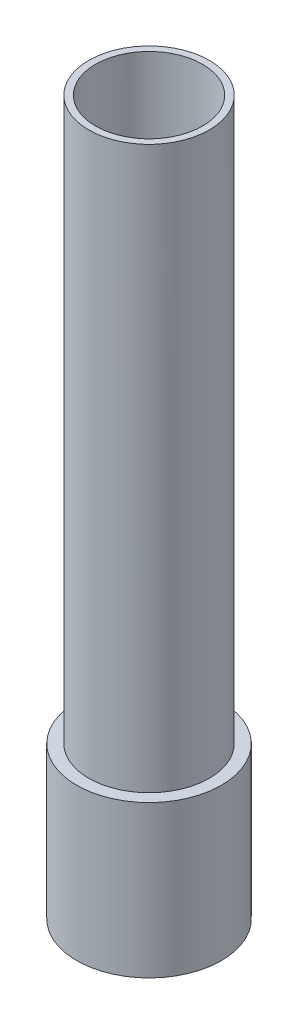
ISO-10303-21;
HEADER;
FILE_DESCRIPTION(('STEP AP214'),'2;1');
FILE_NAME('part.step','',(''),(''),'','','');
FILE_SCHEMA(('AUTOMOTIVE_DESIGN { 1 0 10303 214 1 1 1 1 }'));
ENDSEC;
DATA;
#1=APPLICATION_CONTEXT('core data for automotive mechanical design processes');
#2=APPLICATION_PROTOCOL_DEFINITION('international standard','automotive_design',2000,#1);
#3=PRODUCT_CONTEXT('',#1,'mechanical');
#4=PRODUCT('Part','Part','',(#3));
#5=PRODUCT_RELATED_PRODUCT_CATEGORY('part','',(#4));
#6=PRODUCT_DEFINITION_FORMATION('','',#4);
#7=PRODUCT_DEFINITION_CONTEXT('part definition',#1,'design');
#8=PRODUCT_DEFINITION('design','',#6,#7);
#9=PRODUCT_DEFINITION_SHAPE('','',#8);
#10=(LENGTH_UNIT() NAMED_UNIT(*) SI_UNIT(.MILLI.,.METRE.));
#11=(NAMED_UNIT(*) PLANE_ANGLE_UNIT() SI_UNIT($,.RADIAN.));
#12=(NAMED_UNIT(*) SI_UNIT($,.STERADIAN.) SOLID_ANGLE_UNIT());
#13=UNCERTAINTY_MEASURE_WITH_UNIT(LENGTH_MEASURE(1.E-05),#10,'distance_accuracy_value','');
#14=(GEOMETRIC_REPRESENTATION_CONTEXT(3) GLOBAL_UNCERTAINTY_ASSIGNED_CONTEXT((#13)) GLOBAL_UNIT_ASSIGNED_CONTEXT((#10,
#11,#12)) REPRESENTATION_CONTEXT('',''));
#15=CARTESIAN_POINT('',(0.,0.,0.));
#16=DIRECTION('',(0.,0.,1.));
#17=DIRECTION('',(1.,0.,0.));
#18=AXIS2_PLACEMENT_3D('',#15,#16,#17);
#19=CARTESIAN_POINT('',(13.6326591615901,93.93,-6.07942908557396));
#20=DIRECTION('',(0.,-1.,0.));
#21=DIRECTION('',(0.,0.,-1.));
#22=AXIS2_PLACEMENT_3D('',#19,#20,#21);
#23=CYLINDRICAL_SURFACE('',#22,7.0485);
#24=CARTESIAN_POINT('',(13.6326591615901,93.93,-6.07942908557396));
#25=DIRECTION('',(0.,1.,0.));
#26=DIRECTION('',(0.,0.,1.));
#27=AXIS2_PLACEMENT_3D('',#24,#25,#26);
#28=CIRCLE('',#27,7.0485);
#29=CARTESIAN_POINT('',(13.6326591615901,93.93,0.969070914426036));
#30=VERTEX_POINT('',#29);
#31=EDGE_CURVE('E43',#30,#30,#28,.T.);
#32=ORIENTED_EDGE('',*,*,#31,.T.);
#33=EDGE_LOOP('',(#32));
#34=FACE_BOUND('',#33,.T.);
#35=CARTESIAN_POINT('',(13.6326591615901,16.0866641952226,-6.07942908557396));
#36=DIRECTION('',(0.,-1.,0.));
#37=DIRECTION('',(0.,0.,-1.));
#38=AXIS2_PLACEMENT_3D('',#35,#36,#37);
#39=CIRCLE('',#38,7.0485);
#40=CARTESIAN_POINT('',(13.6326591615901,16.0866641952226,-13.127929085574));
#41=VERTEX_POINT('',#40);
#42=EDGE_CURVE('E35',#41,#41,#39,.T.);
#43=ORIENTED_EDGE('',*,*,#42,.T.);
#44=EDGE_LOOP('',(#43));
#45=FACE_BOUND('',#44,.T.);
#46=ADVANCED_FACE('F31',(#34,#45),#23,.F.);
#47=CARTESIAN_POINT('',(13.6326591615901,93.93,-6.07942908557396));
#48=DIRECTION('',(0.,-1.,0.));
#49=DIRECTION('',(0.,0.,-1.));
#50=AXIS2_PLACEMENT_3D('',#47,#48,#49);
#51=CYLINDRICAL_SURFACE('',#50,7.9375);
#52=CARTESIAN_POINT('',(13.6326591615901,93.93,-6.07942908557396));
#53=DIRECTION('',(0.,1.,0.));
#54=DIRECTION('',(0.,0.,1.));
#55=AXIS2_PLACEMENT_3D('',#52,#53,#54);
#56=CIRCLE('',#55,7.9375);
#57=CARTESIAN_POINT('',(13.6326591615901,93.93,1.85807091442604));
#58=VERTEX_POINT('',#57);
#59=EDGE_CURVE('E39',#58,#58,#56,.T.);
#60=ORIENTED_EDGE('',*,*,#59,.F.);
#61=EDGE_LOOP('',(#60));
#62=FACE_BOUND('',#61,.T.);
#63=CARTESIAN_POINT('',(13.6326591615901,20.,-6.07942908557396));
#64=DIRECTION('',(0.,-1.,0.));
#65=DIRECTION('',(0.,0.,-1.));
#66=AXIS2_PLACEMENT_3D('',#63,#64,#65);
#67=CIRCLE('',#66,7.9375);
#68=CARTESIAN_POINT('',(13.6326591615901,20.,-14.016929085574));
#69=VERTEX_POINT('',#68);
#70=EDGE_CURVE('E10',#69,#69,#67,.T.);
#71=ORIENTED_EDGE('',*,*,#70,.F.);
#72=EDGE_LOOP('',(#71));
#73=FACE_BOUND('',#72,.T.);
#74=ADVANCED_FACE('F33',(#62,#73),#51,.T.);
#75=CARTESIAN_POINT('',(13.6326591615901,93.93,-6.07942908557396));
#76=DIRECTION('',(0.,1.,0.));
#77=DIRECTION('',(0.,0.,1.));
#78=AXIS2_PLACEMENT_3D('',#75,#76,#77);
#79=PLANE('',#78);
#80=ORIENTED_EDGE('',*,*,#59,.T.);
#81=EDGE_LOOP('',(#80));
#82=FACE_BOUND('',#81,.T.);
#83=ORIENTED_EDGE('',*,*,#31,.F.);
#84=EDGE_LOOP('',(#83));
#85=FACE_BOUND('',#84,.T.);
#86=ADVANCED_FACE('F81',(#82,#85),#79,.T.);
#87=CARTESIAN_POINT('',(13.6326591615901,0.,-6.07942908557396));
#88=DIRECTION('',(0.,1.,0.));
#89=DIRECTION('',(0.,0.,1.));
#90=AXIS2_PLACEMENT_3D('',#87,#88,#89);
#91=PLANE('',#90);
#92=CARTESIAN_POINT('',(13.6326591615901,0.,-6.07942908557396));
#93=DIRECTION('',(0.,-1.,0.));
#94=DIRECTION('',(0.,0.,-1.));
#95=AXIS2_PLACEMENT_3D('',#92,#93,#94);
#96=CIRCLE('',#95,8.33501);
#97=CARTESIAN_POINT('',(13.6326591615901,0.,-14.414439085574));
#98=VERTEX_POINT('',#97);
#99=EDGE_CURVE('E54',#98,#98,#96,.T.);
#100=ORIENTED_EDGE('',*,*,#99,.F.);
#101=EDGE_LOOP('',(#100));
#102=FACE_BOUND('',#101,.T.);
#103=CARTESIAN_POINT('',(13.6326591615901,0.,-6.07942908557396));
#104=DIRECTION('',(0.,-1.,0.));
#105=DIRECTION('',(0.,0.,-1.));
#106=AXIS2_PLACEMENT_3D('',#103,#104,#105);
#107=CIRCLE('',#106,9.525);
#108=CARTESIAN_POINT('',(13.6326591615901,0.,-15.604429085574));
#109=VERTEX_POINT('',#108);
#110=EDGE_CURVE('E49',#109,#109,#107,.T.);
#111=ORIENTED_EDGE('',*,*,#110,.T.);
#112=EDGE_LOOP('',(#111));
#113=FACE_BOUND('',#112,.T.);
#114=ADVANCED_FACE('F88',(#102,#113),#91,.F.);
#115=CARTESIAN_POINT('',(13.6326591615901,20.,-6.07942908557396));
#116=DIRECTION('',(0.,-1.,0.));
#117=DIRECTION('',(0.,0.,-1.));
#118=AXIS2_PLACEMENT_3D('',#115,#116,#117);
#119=CYLINDRICAL_SURFACE('',#118,9.525);
#120=CARTESIAN_POINT('',(13.6326591615901,20.,-6.07942908557396));
#121=DIRECTION('',(0.,-1.,0.));
#122=DIRECTION('',(0.,0.,-1.));
#123=AXIS2_PLACEMENT_3D('',#120,#121,#122);
#124=CIRCLE('',#123,9.525);
#125=CARTESIAN_POINT('',(13.6326591615901,20.,-15.604429085574));
#126=VERTEX_POINT('',#125);
#127=EDGE_CURVE('E48',#126,#126,#124,.T.);
#128=ORIENTED_EDGE('',*,*,#127,.T.);
#129=EDGE_LOOP('',(#128));
#130=FACE_BOUND('',#129,.T.);
#131=ORIENTED_EDGE('',*,*,#110,.F.);
#132=EDGE_LOOP('',(#131));
#133=FACE_BOUND('',#132,.T.);
#134=ADVANCED_FACE('F85',(#130,#133),#119,.T.);
#135=CARTESIAN_POINT('',(13.6326591615901,20.,-6.07942908557396));
#136=DIRECTION('',(0.,-1.,0.));
#137=DIRECTION('',(0.,0.,-1.));
#138=AXIS2_PLACEMENT_3D('',#135,#136,#137);
#139=PLANE('',#138);
#140=ORIENTED_EDGE('',*,*,#70,.T.);
#141=EDGE_LOOP('',(#140));
#142=FACE_BOUND('',#141,.T.);
#143=ORIENTED_EDGE('',*,*,#127,.F.);
#144=EDGE_LOOP('',(#143));
#145=FACE_BOUND('',#144,.T.);
#146=ADVANCED_FACE('F72',(#142,#145),#139,.F.);
#147=CARTESIAN_POINT('',(13.6326591615901,16.0866641952226,-6.07942908557396));
#148=DIRECTION('',(0.,-1.,0.));
#149=DIRECTION('',(0.,0.,-1.));
#150=AXIS2_PLACEMENT_3D('',#147,#148,#149);
#151=CYLINDRICAL_SURFACE('',#150,8.33501);
#152=CARTESIAN_POINT('',(13.6326591615901,16.0866641952226,-6.07942908557396));
#153=DIRECTION('',(0.,-1.,0.));
#154=DIRECTION('',(0.,0.,-1.));
#155=AXIS2_PLACEMENT_3D('',#152,#153,#154);
#156=CIRCLE('',#155,8.33501);
#157=CARTESIAN_POINT('',(13.6326591615901,16.0866641952226,-14.414439085574));
#158=VERTEX_POINT('',#157);
#159=EDGE_CURVE('E57',#158,#158,#156,.T.);
#160=ORIENTED_EDGE('',*,*,#159,.F.);
#161=EDGE_LOOP('',(#160));
#162=FACE_BOUND('',#161,.T.);
#163=ORIENTED_EDGE('',*,*,#99,.T.);
#164=EDGE_LOOP('',(#163));
#165=FACE_BOUND('',#164,.T.);
#166=ADVANCED_FACE('F67',(#162,#165),#151,.F.);
#167=CARTESIAN_POINT('',(13.6326591615901,16.0866641952226,-6.07942908557396));
#168=DIRECTION('',(0.,-1.,0.));
#169=DIRECTION('',(0.,0.,-1.));
#170=AXIS2_PLACEMENT_3D('',#167,#168,#169);
#171=PLANE('',#170);
#172=ORIENTED_EDGE('',*,*,#42,.F.);
#173=EDGE_LOOP('',(#172));
#174=FACE_BOUND('',#173,.T.);
#175=ORIENTED_EDGE('',*,*,#159,.T.);
#176=EDGE_LOOP('',(#175));
#177=FACE_BOUND('',#176,.T.);
#178=ADVANCED_FACE('F65',(#174,#177),#171,.T.);
#179=CLOSED_SHELL('',(#46,#74,#86,#114,#134,#146,#166,#178));
#180=MANIFOLD_SOLID_BREP('B2',#179);
#181=ADVANCED_BREP_SHAPE_REPRESENTATION('',(#18,#180),#14);
#182=SHAPE_DEFINITION_REPRESENTATION(#9,#181);
ENDSEC;
END-ISO-10303-21;
